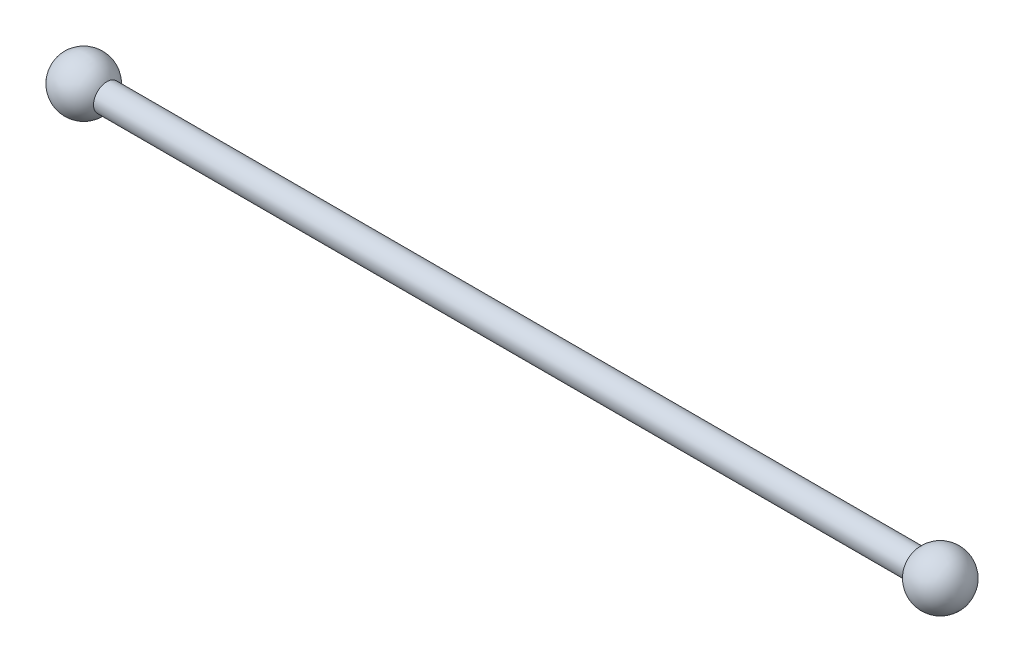
ISO-10303-21;
HEADER;
FILE_DESCRIPTION(('STEP AP214'),'2;1');
FILE_NAME('part.step','',(''),(''),'','','');
FILE_SCHEMA(('AUTOMOTIVE_DESIGN { 1 0 10303 214 1 1 1 1 }'));
ENDSEC;
DATA;
#1=APPLICATION_CONTEXT('core data for automotive mechanical design processes');
#2=APPLICATION_PROTOCOL_DEFINITION('international standard','automotive_design',2000,#1);
#3=PRODUCT_CONTEXT('',#1,'mechanical');
#4=PRODUCT('Part','Part','',(#3));
#5=PRODUCT_RELATED_PRODUCT_CATEGORY('part','',(#4));
#6=PRODUCT_DEFINITION_FORMATION('','',#4);
#7=PRODUCT_DEFINITION_CONTEXT('part definition',#1,'design');
#8=PRODUCT_DEFINITION('design','',#6,#7);
#9=PRODUCT_DEFINITION_SHAPE('','',#8);
#10=(LENGTH_UNIT() NAMED_UNIT(*) SI_UNIT(.MILLI.,.METRE.));
#11=(NAMED_UNIT(*) PLANE_ANGLE_UNIT() SI_UNIT($,.RADIAN.));
#12=(NAMED_UNIT(*) SI_UNIT($,.STERADIAN.) SOLID_ANGLE_UNIT());
#13=UNCERTAINTY_MEASURE_WITH_UNIT(LENGTH_MEASURE(1.E-05),#10,'distance_accuracy_value','');
#14=(GEOMETRIC_REPRESENTATION_CONTEXT(3) GLOBAL_UNCERTAINTY_ASSIGNED_CONTEXT((#13)) GLOBAL_UNIT_ASSIGNED_CONTEXT((#10,
#11,#12)) REPRESENTATION_CONTEXT('',''));
#15=CARTESIAN_POINT('',(0.,0.,0.));
#16=DIRECTION('',(0.,0.,1.));
#17=DIRECTION('',(1.,0.,0.));
#18=AXIS2_PLACEMENT_3D('',#15,#16,#17);
#19=CARTESIAN_POINT('',(-40.,0.,0.));
#20=DIRECTION('',(1.,0.,0.));
#21=DIRECTION('',(0.,1.,0.));
#22=AXIS2_PLACEMENT_3D('',#19,#20,#21);
#23=SPHERICAL_SURFACE('',#22,2.5);
#24=CARTESIAN_POINT('',(-37.8349364905389,0.,0.));
#25=DIRECTION('',(1.,0.,0.));
#26=DIRECTION('',(0.,1.,0.));
#27=AXIS2_PLACEMENT_3D('',#24,#25,#26);
#28=CIRCLE('',#27,1.25000000000001);
#29=CARTESIAN_POINT('',(-37.8349364905389,1.25,0.));
#30=VERTEX_POINT('',#29);
#31=EDGE_CURVE('E44',#30,#30,#28,.T.);
#32=ORIENTED_EDGE('',*,*,#31,.F.);
#33=EDGE_LOOP('',(#32));
#34=FACE_BOUND('',#33,.T.);
#35=ADVANCED_FACE('F37',(#34),#23,.T.);
#36=CARTESIAN_POINT('',(40.,0.,0.));
#37=DIRECTION('',(1.,0.,0.));
#38=DIRECTION('',(0.,-1.,0.));
#39=AXIS2_PLACEMENT_3D('',#36,#37,#38);
#40=SPHERICAL_SURFACE('',#39,2.5);
#41=CARTESIAN_POINT('',(37.8349364905389,0.,0.));
#42=DIRECTION('',(1.,0.,0.));
#43=DIRECTION('',(0.,1.,0.));
#44=AXIS2_PLACEMENT_3D('',#41,#42,#43);
#45=CIRCLE('',#44,1.25);
#46=CARTESIAN_POINT('',(37.8349364905389,1.25,0.));
#47=VERTEX_POINT('',#46);
#48=EDGE_CURVE('E10',#47,#47,#45,.T.);
#49=ORIENTED_EDGE('',*,*,#48,.T.);
#50=EDGE_LOOP('',(#49));
#51=FACE_BOUND('',#50,.T.);
#52=ADVANCED_FACE('F55',(#51),#40,.T.);
#53=CARTESIAN_POINT('',(0.,0.,0.));
#54=DIRECTION('',(1.,0.,0.));
#55=DIRECTION('',(0.,1.,0.));
#56=AXIS2_PLACEMENT_3D('',#53,#54,#55);
#57=CYLINDRICAL_SURFACE('',#56,1.25);
#58=ORIENTED_EDGE('',*,*,#31,.T.);
#59=EDGE_LOOP('',(#58));
#60=FACE_BOUND('',#59,.T.);
#61=ORIENTED_EDGE('',*,*,#48,.F.);
#62=EDGE_LOOP('',(#61));
#63=FACE_BOUND('',#62,.T.);
#64=ADVANCED_FACE('F51',(#60,#63),#57,.T.);
#65=CLOSED_SHELL('',(#35,#52,#64));
#66=MANIFOLD_SOLID_BREP('B2',#65);
#67=ADVANCED_BREP_SHAPE_REPRESENTATION('',(#18,#66),#14);
#68=SHAPE_DEFINITION_REPRESENTATION(#9,#67);
ENDSEC;
END-ISO-10303-21;
